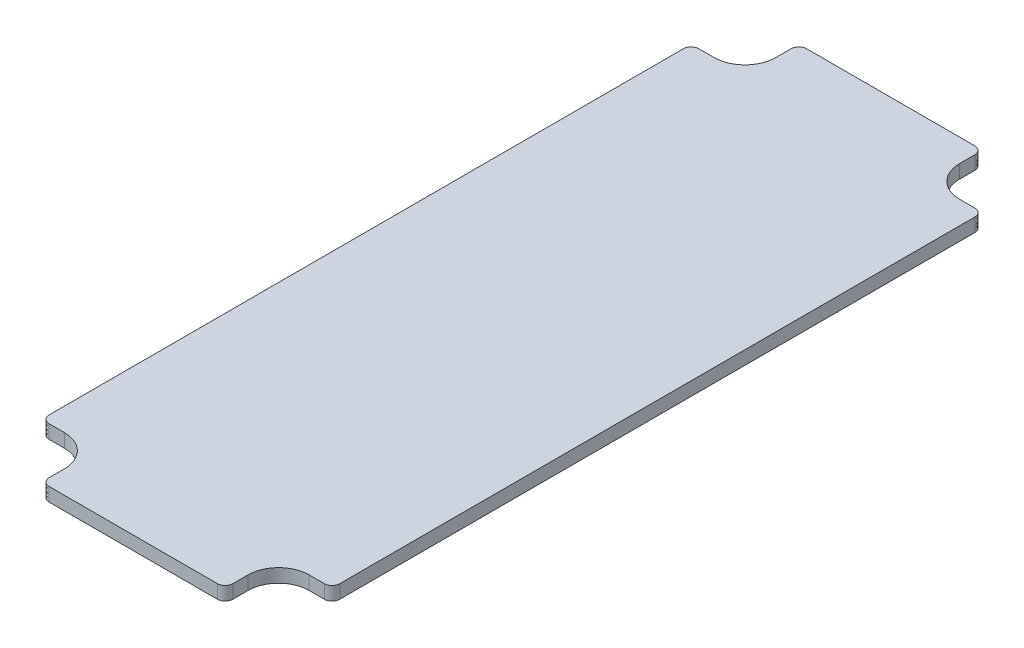
ISO-10303-21;
HEADER;
FILE_DESCRIPTION(('STEP AP214'),'2;1');
FILE_NAME('part.step','',(''),(''),'','','');
FILE_SCHEMA(('AUTOMOTIVE_DESIGN { 1 0 10303 214 1 1 1 1 }'));
ENDSEC;
DATA;
#1=APPLICATION_CONTEXT('core data for automotive mechanical design processes');
#2=APPLICATION_PROTOCOL_DEFINITION('international standard','automotive_design',2000,#1);
#3=PRODUCT_CONTEXT('',#1,'mechanical');
#4=PRODUCT('Part','Part','',(#3));
#5=PRODUCT_RELATED_PRODUCT_CATEGORY('part','',(#4));
#6=PRODUCT_DEFINITION_FORMATION('','',#4);
#7=PRODUCT_DEFINITION_CONTEXT('part definition',#1,'design');
#8=PRODUCT_DEFINITION('design','',#6,#7);
#9=PRODUCT_DEFINITION_SHAPE('','',#8);
#10=(LENGTH_UNIT() NAMED_UNIT(*) SI_UNIT(.MILLI.,.METRE.));
#11=(NAMED_UNIT(*) PLANE_ANGLE_UNIT() SI_UNIT($,.RADIAN.));
#12=(NAMED_UNIT(*) SI_UNIT($,.STERADIAN.) SOLID_ANGLE_UNIT());
#13=UNCERTAINTY_MEASURE_WITH_UNIT(LENGTH_MEASURE(1.E-05),#10,'distance_accuracy_value','');
#14=(GEOMETRIC_REPRESENTATION_CONTEXT(3) GLOBAL_UNCERTAINTY_ASSIGNED_CONTEXT((#13)) GLOBAL_UNIT_ASSIGNED_CONTEXT((#10,
#11,#12)) REPRESENTATION_CONTEXT('',''));
#15=CARTESIAN_POINT('',(0.,0.,0.));
#16=DIRECTION('',(0.,0.,1.));
#17=DIRECTION('',(1.,0.,0.));
#18=AXIS2_PLACEMENT_3D('',#15,#16,#17);
#19=CARTESIAN_POINT('',(-9.7028101652106,-13.879847669631,43.9524674901858));
#20=CARTESIAN_POINT('',(-9.81520922461106,-13.879847669631,43.9524674901858));
#21=CARTESIAN_POINT('',(-10.0350353697338,-13.879847669631,43.9138110143199));
#22=CARTESIAN_POINT('',(-10.3587966532664,-13.879847669631,43.708796653266));
#23=CARTESIAN_POINT('',(-10.5638110143203,-13.879847669631,43.3850353697334));
#24=CARTESIAN_POINT('',(-10.6024674901861,-13.879847669631,43.1652092246106));
#25=CARTESIAN_POINT('',(-10.6024674901861,-13.879847669631,43.0528101652102));
#26=B_SPLINE_CURVE_WITH_KNOTS('',3,(#19,#20,#21,#22,#23,#24,#25),.UNSPECIFIED.,.F.,.F.,(4,1,1,1,
4),(0.,0.25,0.5,0.75,1.),.UNSPECIFIED.);
#27=DIRECTION('',(0.,-1.,0.));
#28=VECTOR('',#27,1.);
#29=SURFACE_OF_LINEAR_EXTRUSION('',#26,#28);
#30=CARTESIAN_POINT('',(-9.70281016521058,-15.449847669631,43.9524674901858));
#31=CARTESIAN_POINT('',(-9.81520922461103,-15.449847669631,43.9524674901858));
#32=CARTESIAN_POINT('',(-10.0350353697338,-15.449847669631,43.9138110143199));
#33=CARTESIAN_POINT('',(-10.3587966532664,-15.449847669631,43.7087966532661));
#34=CARTESIAN_POINT('',(-10.5638110143202,-15.449847669631,43.3850353697335));
#35=CARTESIAN_POINT('',(-10.6024674901861,-15.449847669631,43.1652092246107));
#36=CARTESIAN_POINT('',(-10.6024674901861,-15.449847669631,43.0528101652102));
#37=B_SPLINE_CURVE_WITH_KNOTS('',3,(#30,#31,#32,#33,#34,#35,#36),.UNSPECIFIED.,.F.,.F.,(4,1,1,1,
4),(0.,0.25,0.5,0.75,1.),.UNSPECIFIED.);
#38=CARTESIAN_POINT('',(-9.70281016521058,-15.449847669631,43.9524674901858));
#39=VERTEX_POINT('',#38);
#40=CARTESIAN_POINT('',(-10.6024674901861,-15.449847669631,43.0528101652102));
#41=VERTEX_POINT('',#40);
#42=EDGE_CURVE('E393',#39,#41,#37,.T.);
#43=ORIENTED_EDGE('',*,*,#42,.F.);
#44=DIRECTION('',(0.,-1.,0.));
#45=VECTOR('',#44,1.);
#46=CARTESIAN_POINT('',(-9.7028101652106,-13.879847669631,43.9524674901858));
#47=LINE('',#46,#45);
#48=CARTESIAN_POINT('',(-9.7028101652106,-13.879847669631,43.9524674901858));
#49=VERTEX_POINT('',#48);
#50=EDGE_CURVE('E11',#49,#39,#47,.T.);
#51=ORIENTED_EDGE('',*,*,#50,.F.);
#52=CARTESIAN_POINT('',(-10.6024674901861,-13.879847669631,43.0528101652102));
#53=VERTEX_POINT('',#52);
#54=EDGE_CURVE('E341',#49,#53,#26,.T.);
#55=ORIENTED_EDGE('',*,*,#54,.T.);
#56=DIRECTION('',(0.,-1.,0.));
#57=VECTOR('',#56,1.);
#58=CARTESIAN_POINT('',(-10.6024674901861,-13.879847669631,43.0528101652102));
#59=LINE('',#58,#57);
#60=EDGE_CURVE('E37',#53,#41,#59,.T.);
#61=ORIENTED_EDGE('',*,*,#60,.T.);
#62=EDGE_LOOP('',(#43,#51,#55,#61));
#63=FACE_BOUND('',#62,.T.);
#64=ADVANCED_FACE('F33',(#63),#29,.T.);
#65=CARTESIAN_POINT('',(-9.7028101652106,-13.879847669631,43.9524674901858));
#66=DIRECTION('',(0.,0.,1.));
#67=DIRECTION('',(0.,-1.,0.));
#68=AXIS2_PLACEMENT_3D('',#65,#66,#67);
#69=PLANE('',#68);
#70=DIRECTION('',(-1.,0.,0.));
#71=VECTOR('',#70,1.);
#72=CARTESIAN_POINT('',(-9.70281016521058,-15.449847669631,43.9524674901858));
#73=LINE('',#72,#71);
#74=CARTESIAN_POINT('',(9.8028101652091,-15.4498476696307,43.9524674901862));
#75=VERTEX_POINT('',#74);
#76=EDGE_CURVE('E319',#75,#39,#73,.T.);
#77=ORIENTED_EDGE('',*,*,#76,.F.);
#78=DIRECTION('',(0.,-1.,0.));
#79=VECTOR('',#78,1.);
#80=CARTESIAN_POINT('',(9.80281016520908,-13.8798476696307,43.9524674901861));
#81=LINE('',#80,#79);
#82=CARTESIAN_POINT('',(9.80281016520908,-13.8798476696307,43.9524674901861));
#83=VERTEX_POINT('',#82);
#84=EDGE_CURVE('E43',#83,#75,#81,.T.);
#85=ORIENTED_EDGE('',*,*,#84,.F.);
#86=DIRECTION('',(-1.,0.,0.));
#87=VECTOR('',#86,1.);
#88=CARTESIAN_POINT('',(-9.7028101652106,-13.879847669631,43.9524674901858));
#89=LINE('',#88,#87);
#90=EDGE_CURVE('E217',#83,#49,#89,.T.);
#91=ORIENTED_EDGE('',*,*,#90,.T.);
#92=ORIENTED_EDGE('',*,*,#50,.T.);
#93=EDGE_LOOP('',(#77,#85,#91,#92));
#94=FACE_BOUND('',#93,.T.);
#95=ADVANCED_FACE('F237',(#94),#69,.T.);
#96=CARTESIAN_POINT('',(10.7024674901847,-13.8798476696307,43.0528101652106));
#97=CARTESIAN_POINT('',(10.7024674901847,-13.8798476696307,43.165209224611));
#98=CARTESIAN_POINT('',(10.6638110143188,-13.8798476696307,43.3850353697338));
#99=CARTESIAN_POINT('',(10.4587966532649,-13.8798476696307,43.7087966532664));
#100=CARTESIAN_POINT('',(10.1350353697323,-13.8798476696307,43.9138110143202));
#101=CARTESIAN_POINT('',(9.91520922460954,-13.8798476696307,43.9524674901861));
#102=CARTESIAN_POINT('',(9.80281016520908,-13.8798476696307,43.9524674901861));
#103=B_SPLINE_CURVE_WITH_KNOTS('',3,(#96,#97,#98,#99,#100,#101,#102),.UNSPECIFIED.,.F.,.F.,(4,1,
1,1,4),(0.,0.25,0.5,0.75,1.),.UNSPECIFIED.);
#104=DIRECTION('',(0.,-1.,0.));
#105=VECTOR('',#104,1.);
#106=SURFACE_OF_LINEAR_EXTRUSION('',#103,#105);
#107=CARTESIAN_POINT('',(10.7024674901847,-15.4498476696307,43.0528101652106));
#108=CARTESIAN_POINT('',(10.7024674901847,-15.4498476696307,43.1652092246111));
#109=CARTESIAN_POINT('',(10.6638110143188,-15.4498476696307,43.3850353697338));
#110=CARTESIAN_POINT('',(10.458796653265,-15.4498476696307,43.7087966532665));
#111=CARTESIAN_POINT('',(10.1350353697323,-15.4498476696307,43.9138110143203));
#112=CARTESIAN_POINT('',(9.91520922460956,-15.4498476696307,43.9524674901862));
#113=CARTESIAN_POINT('',(9.8028101652091,-15.4498476696307,43.9524674901862));
#114=B_SPLINE_CURVE_WITH_KNOTS('',3,(#107,#108,#109,#110,#111,#112,#113),.UNSPECIFIED.,.F.,.F.,
(4,1,1,1,4),(0.,0.25,0.5,0.75,1.),.UNSPECIFIED.);
#115=CARTESIAN_POINT('',(10.7024674901847,-15.4498476696307,43.0528101652106));
#116=VERTEX_POINT('',#115);
#117=EDGE_CURVE('E204',#116,#75,#114,.T.);
#118=ORIENTED_EDGE('',*,*,#117,.F.);
#119=DIRECTION('',(0.,-1.,0.));
#120=VECTOR('',#119,1.);
#121=CARTESIAN_POINT('',(10.7024674901847,-13.8798476696307,43.0528101652106));
#122=LINE('',#121,#120);
#123=CARTESIAN_POINT('',(10.7024674901847,-13.8798476696307,43.0528101652106));
#124=VERTEX_POINT('',#123);
#125=EDGE_CURVE('E199',#124,#116,#122,.T.);
#126=ORIENTED_EDGE('',*,*,#125,.F.);
#127=EDGE_CURVE('E202',#124,#83,#103,.T.);
#128=ORIENTED_EDGE('',*,*,#127,.T.);
#129=ORIENTED_EDGE('',*,*,#84,.T.);
#130=EDGE_LOOP('',(#118,#126,#128,#129));
#131=FACE_BOUND('',#130,.T.);
#132=ADVANCED_FACE('F201',(#131),#106,.T.);
#133=CARTESIAN_POINT('',(10.7024674901847,-13.8798476696307,43.0528101652106));
#134=DIRECTION('',(1.,0.,0.));
#135=DIRECTION('',(0.,1.,0.));
#136=AXIS2_PLACEMENT_3D('',#133,#134,#135);
#137=PLANE('',#136);
#138=DIRECTION('',(0.,0.,1.));
#139=VECTOR('',#138,1.);
#140=CARTESIAN_POINT('',(10.7024674901847,-15.4498476696307,43.0528101652106));
#141=LINE('',#140,#139);
#142=CARTESIAN_POINT('',(10.7024674901847,-15.4498476696308,41.3000000000008));
#143=VERTEX_POINT('',#142);
#144=EDGE_CURVE('E326',#143,#116,#141,.T.);
#145=ORIENTED_EDGE('',*,*,#144,.F.);
#146=DIRECTION('',(0.,-1.,0.));
#147=VECTOR('',#146,1.);
#148=CARTESIAN_POINT('',(10.7024674901847,-13.8798476696308,41.3000000000008));
#149=LINE('',#148,#147);
#150=CARTESIAN_POINT('',(10.7024674901847,-13.8798476696308,41.3000000000008));
#151=VERTEX_POINT('',#150);
#152=EDGE_CURVE('E209',#151,#143,#149,.T.);
#153=ORIENTED_EDGE('',*,*,#152,.F.);
#154=DIRECTION('',(0.,0.,1.));
#155=VECTOR('',#154,1.);
#156=CARTESIAN_POINT('',(10.7024674901847,-13.8798476696307,43.0528101652106));
#157=LINE('',#156,#155);
#158=EDGE_CURVE('E215',#151,#124,#157,.T.);
#159=ORIENTED_EDGE('',*,*,#158,.T.);
#160=ORIENTED_EDGE('',*,*,#125,.T.);
#161=EDGE_LOOP('',(#145,#153,#159,#160));
#162=FACE_BOUND('',#161,.T.);
#163=ADVANCED_FACE('F219',(#162),#137,.T.);
#164=CARTESIAN_POINT('',(14.2499999999993,-13.8798476696308,41.3000000000008));
#165=DIRECTION('',(0.,-1.,0.));
#166=DIRECTION('',(0.,0.,-1.));
#167=AXIS2_PLACEMENT_3D('',#164,#165,#166);
#168=CYLINDRICAL_SURFACE('',#167,3.54753250981462);
#169=CARTESIAN_POINT('',(14.2499999999993,-15.4498476696308,41.3000000000009));
#170=DIRECTION('',(0.,1.,0.));
#171=DIRECTION('',(0.,0.,-1.));
#172=AXIS2_PLACEMENT_3D('',#169,#170,#171);
#173=CIRCLE('',#172,3.54753250981462);
#174=CARTESIAN_POINT('',(14.2499999999993,-15.4498476696309,37.7524674901863));
#175=VERTEX_POINT('',#174);
#176=EDGE_CURVE('E324',#175,#143,#173,.T.);
#177=ORIENTED_EDGE('',*,*,#176,.F.);
#178=DIRECTION('',(0.,-1.,0.));
#179=VECTOR('',#178,1.);
#180=CARTESIAN_POINT('',(14.2499999999993,-13.8798476696309,37.7524674901862));
#181=LINE('',#180,#179);
#182=CARTESIAN_POINT('',(14.2499999999993,-13.8798476696309,37.7524674901862));
#183=VERTEX_POINT('',#182);
#184=EDGE_CURVE('E270',#183,#175,#181,.T.);
#185=ORIENTED_EDGE('',*,*,#184,.F.);
#186=CARTESIAN_POINT('',(14.2499999999993,-13.8798476696308,41.3000000000008));
#187=DIRECTION('',(0.,1.,0.));
#188=DIRECTION('',(0.,0.,-1.));
#189=AXIS2_PLACEMENT_3D('',#186,#187,#188);
#190=CIRCLE('',#189,3.54753250981462);
#191=EDGE_CURVE('E220',#183,#151,#190,.T.);
#192=ORIENTED_EDGE('',*,*,#191,.T.);
#193=ORIENTED_EDGE('',*,*,#152,.T.);
#194=EDGE_LOOP('',(#177,#185,#192,#193));
#195=FACE_BOUND('',#194,.T.);
#196=ADVANCED_FACE('F241',(#195),#168,.F.);
#197=CARTESIAN_POINT('',(14.2499999999994,-13.8798476696309,37.7524674901863));
#198=DIRECTION('',(0.,0.,1.));
#199=DIRECTION('',(0.,-1.,0.));
#200=AXIS2_PLACEMENT_3D('',#197,#198,#199);
#201=PLANE('',#200);
#202=DIRECTION('',(-1.,0.,0.));
#203=VECTOR('',#202,1.);
#204=CARTESIAN_POINT('',(14.2499999999994,-15.4498476696309,37.7524674901863));
#205=LINE('',#204,#203);
#206=CARTESIAN_POINT('',(16.0028101652093,-15.4498476696309,37.7524674901864));
#207=VERTEX_POINT('',#206);
#208=EDGE_CURVE('E331',#207,#175,#205,.T.);
#209=ORIENTED_EDGE('',*,*,#208,.F.);
#210=DIRECTION('',(0.,-1.,0.));
#211=VECTOR('',#210,1.);
#212=CARTESIAN_POINT('',(16.0028101652093,-13.8798476696309,37.7524674901863));
#213=LINE('',#212,#211);
#214=CARTESIAN_POINT('',(16.0028101652093,-13.8798476696309,37.7524674901863));
#215=VERTEX_POINT('',#214);
#216=EDGE_CURVE('E272',#215,#207,#213,.T.);
#217=ORIENTED_EDGE('',*,*,#216,.F.);
#218=DIRECTION('',(-1.,0.,0.));
#219=VECTOR('',#218,1.);
#220=CARTESIAN_POINT('',(14.2499999999994,-13.8798476696309,37.7524674901863));
#221=LINE('',#220,#219);
#222=EDGE_CURVE('E222',#215,#183,#221,.T.);
#223=ORIENTED_EDGE('',*,*,#222,.T.);
#224=ORIENTED_EDGE('',*,*,#184,.T.);
#225=EDGE_LOOP('',(#209,#217,#223,#224));
#226=FACE_BOUND('',#225,.T.);
#227=ADVANCED_FACE('F244',(#226),#201,.T.);
#228=CARTESIAN_POINT('',(16.9024674901849,-13.8798476696309,36.8528101652108));
#229=CARTESIAN_POINT('',(16.9024674901848,-13.8798476696309,36.9652092246112));
#230=CARTESIAN_POINT('',(16.863811014319,-13.8798476696309,37.185035369734));
#231=CARTESIAN_POINT('',(16.6587966532651,-13.8798476696309,37.5087966532666));
#232=CARTESIAN_POINT('',(16.3350353697325,-13.8798476696309,37.7138110143204));
#233=CARTESIAN_POINT('',(16.1152092246097,-13.8798476696309,37.7524674901863));
#234=CARTESIAN_POINT('',(16.0028101652093,-13.8798476696309,37.7524674901863));
#235=B_SPLINE_CURVE_WITH_KNOTS('',3,(#228,#229,#230,#231,#232,#233,#234),.UNSPECIFIED.,.F.,.F.,
(4,1,1,1,4),(0.,0.25,0.5,0.75,1.),.UNSPECIFIED.);
#236=DIRECTION('',(0.,-1.,0.));
#237=VECTOR('',#236,1.);
#238=SURFACE_OF_LINEAR_EXTRUSION('',#235,#237);
#239=CARTESIAN_POINT('',(16.9024674901849,-15.4498476696309,36.8528101652108));
#240=CARTESIAN_POINT('',(16.9024674901849,-15.4498476696309,36.9652092246113));
#241=CARTESIAN_POINT('',(16.863811014319,-15.4498476696309,37.1850353697341));
#242=CARTESIAN_POINT('',(16.6587966532652,-15.4498476696309,37.5087966532667));
#243=CARTESIAN_POINT('',(16.3350353697325,-15.4498476696309,37.7138110143205));
#244=CARTESIAN_POINT('',(16.1152092246098,-15.4498476696309,37.7524674901864));
#245=CARTESIAN_POINT('',(16.0028101652093,-15.4498476696309,37.7524674901864));
#246=B_SPLINE_CURVE_WITH_KNOTS('',3,(#239,#240,#241,#242,#243,#244,#245),.UNSPECIFIED.,.F.,.F.,
(4,1,1,1,4),(0.,0.25,0.5,0.75,1.),.UNSPECIFIED.);
#247=CARTESIAN_POINT('',(16.9024674901849,-15.4498476696309,36.8528101652108));
#248=VERTEX_POINT('',#247);
#249=EDGE_CURVE('E279',#248,#207,#246,.T.);
#250=ORIENTED_EDGE('',*,*,#249,.F.);
#251=DIRECTION('',(0.,-1.,0.));
#252=VECTOR('',#251,1.);
#253=CARTESIAN_POINT('',(16.9024674901849,-13.8798476696309,36.8528101652108));
#254=LINE('',#253,#252);
#255=CARTESIAN_POINT('',(16.9024674901849,-13.8798476696309,36.8528101652108));
#256=VERTEX_POINT('',#255);
#257=EDGE_CURVE('E277',#256,#248,#254,.T.);
#258=ORIENTED_EDGE('',*,*,#257,.F.);
#259=EDGE_CURVE('E256',#256,#215,#235,.T.);
#260=ORIENTED_EDGE('',*,*,#259,.T.);
#261=ORIENTED_EDGE('',*,*,#216,.T.);
#262=EDGE_LOOP('',(#250,#258,#260,#261));
#263=FACE_BOUND('',#262,.T.);
#264=ADVANCED_FACE('F248',(#263),#238,.T.);
#265=CARTESIAN_POINT('',(16.9024674901849,-13.8798476696309,36.8528101652108));
#266=DIRECTION('',(1.,0.,0.));
#267=DIRECTION('',(0.,0.,-1.));
#268=AXIS2_PLACEMENT_3D('',#265,#266,#267);
#269=PLANE('',#268);
#270=DIRECTION('',(0.,0.,1.));
#271=VECTOR('',#270,1.);
#272=CARTESIAN_POINT('',(16.9024674901849,-15.4498476696309,36.8528101652108));
#273=LINE('',#272,#271);
#274=CARTESIAN_POINT('',(16.9024674901865,-15.4498476696337,-36.8028101652089));
#275=VERTEX_POINT('',#274);
#276=EDGE_CURVE('E470',#275,#248,#273,.T.);
#277=ORIENTED_EDGE('',*,*,#276,.F.);
#278=DIRECTION('',(0.,-1.,0.));
#279=VECTOR('',#278,1.);
#280=CARTESIAN_POINT('',(16.9024674901865,-13.8798476696337,-36.8028101652089));
#281=LINE('',#280,#279);
#282=CARTESIAN_POINT('',(16.9024674901865,-13.8798476696337,-36.8028101652089));
#283=VERTEX_POINT('',#282);
#284=EDGE_CURVE('E283',#283,#275,#281,.T.);
#285=ORIENTED_EDGE('',*,*,#284,.F.);
#286=DIRECTION('',(0.,0.,1.));
#287=VECTOR('',#286,1.);
#288=CARTESIAN_POINT('',(16.9024674901849,-13.8798476696309,36.8528101652108));
#289=LINE('',#288,#287);
#290=EDGE_CURVE('E262',#283,#256,#289,.T.);
#291=ORIENTED_EDGE('',*,*,#290,.T.);
#292=ORIENTED_EDGE('',*,*,#257,.T.);
#293=EDGE_LOOP('',(#277,#285,#291,#292));
#294=FACE_BOUND('',#293,.T.);
#295=ADVANCED_FACE('F253',(#294),#269,.T.);
#296=CARTESIAN_POINT('',(16.0028101652109,-13.8798476696338,-37.7024674901845));
#297=CARTESIAN_POINT('',(16.1152092246114,-13.8798476696338,-37.7024674901845));
#298=CARTESIAN_POINT('',(16.3350353697342,-13.8798476696338,-37.6638110143186));
#299=CARTESIAN_POINT('',(16.6587966532668,-13.8798476696337,-37.4587966532648));
#300=CARTESIAN_POINT('',(16.8638110143206,-13.8798476696337,-37.1350353697322));
#301=CARTESIAN_POINT('',(16.9024674901865,-13.8798476696337,-36.9152092246094));
#302=CARTESIAN_POINT('',(16.9024674901865,-13.8798476696337,-36.8028101652089));
#303=B_SPLINE_CURVE_WITH_KNOTS('',3,(#296,#297,#298,#299,#300,#301,#302),.UNSPECIFIED.,.F.,.F.,
(4,1,1,1,4),(0.,0.25,0.5,0.75,1.),.UNSPECIFIED.);
#304=DIRECTION('',(0.,-1.,0.));
#305=VECTOR('',#304,1.);
#306=SURFACE_OF_LINEAR_EXTRUSION('',#303,#305);
#307=CARTESIAN_POINT('',(16.0028101652109,-15.4498476696338,-37.7024674901845));
#308=CARTESIAN_POINT('',(16.1152092246114,-15.4498476696338,-37.7024674901845));
#309=CARTESIAN_POINT('',(16.3350353697342,-15.4498476696338,-37.6638110143186));
#310=CARTESIAN_POINT('',(16.6587966532668,-15.4498476696337,-37.4587966532647));
#311=CARTESIAN_POINT('',(16.8638110143206,-15.4498476696337,-37.1350353697321));
#312=CARTESIAN_POINT('',(16.9024674901865,-15.4498476696337,-36.9152092246093));
#313=CARTESIAN_POINT('',(16.9024674901865,-15.4498476696337,-36.8028101652089));
#314=B_SPLINE_CURVE_WITH_KNOTS('',3,(#307,#308,#309,#310,#311,#312,#313),.UNSPECIFIED.,.F.,.F.,
(4,1,1,1,4),(0.,0.25,0.5,0.75,1.),.UNSPECIFIED.);
#315=CARTESIAN_POINT('',(16.0028101652109,-15.4498476696338,-37.7024674901845));
#316=VERTEX_POINT('',#315);
#317=EDGE_CURVE('E465',#316,#275,#314,.T.);
#318=ORIENTED_EDGE('',*,*,#317,.F.);
#319=DIRECTION('',(0.,-1.,0.));
#320=VECTOR('',#319,1.);
#321=CARTESIAN_POINT('',(16.0028101652109,-13.8798476696338,-37.7024674901845));
#322=LINE('',#321,#320);
#323=CARTESIAN_POINT('',(16.0028101652109,-13.8798476696338,-37.7024674901845));
#324=VERTEX_POINT('',#323);
#325=EDGE_CURVE('E286',#324,#316,#322,.T.);
#326=ORIENTED_EDGE('',*,*,#325,.F.);
#327=EDGE_CURVE('E484',#324,#283,#303,.T.);
#328=ORIENTED_EDGE('',*,*,#327,.T.);
#329=ORIENTED_EDGE('',*,*,#284,.T.);
#330=EDGE_LOOP('',(#318,#326,#328,#329));
#331=FACE_BOUND('',#330,.T.);
#332=ADVANCED_FACE('F486',(#331),#306,.T.);
#333=CARTESIAN_POINT('',(16.0028101652109,-13.8798476696338,-37.7024674901845));
#334=DIRECTION('',(0.,0.,-1.));
#335=DIRECTION('',(-1.,0.,0.));
#336=AXIS2_PLACEMENT_3D('',#333,#334,#335);
#337=PLANE('',#336);
#338=DIRECTION('',(1.,0.,0.));
#339=VECTOR('',#338,1.);
#340=CARTESIAN_POINT('',(16.0028101652109,-15.4498476696338,-37.7024674901845));
#341=LINE('',#340,#339);
#342=CARTESIAN_POINT('',(14.250000000001,-15.4498476696338,-37.7024674901846));
#343=VERTEX_POINT('',#342);
#344=EDGE_CURVE('E462',#343,#316,#341,.T.);
#345=ORIENTED_EDGE('',*,*,#344,.F.);
#346=DIRECTION('',(0.,-1.,0.));
#347=VECTOR('',#346,1.);
#348=CARTESIAN_POINT('',(14.250000000001,-13.8798476696338,-37.7024674901846));
#349=LINE('',#348,#347);
#350=CARTESIAN_POINT('',(14.250000000001,-13.8798476696338,-37.7024674901846));
#351=VERTEX_POINT('',#350);
#352=EDGE_CURVE('E291',#351,#343,#349,.T.);
#353=ORIENTED_EDGE('',*,*,#352,.F.);
#354=DIRECTION('',(1.,0.,0.));
#355=VECTOR('',#354,1.);
#356=CARTESIAN_POINT('',(16.0028101652109,-13.8798476696338,-37.7024674901845));
#357=LINE('',#356,#355);
#358=EDGE_CURVE('E487',#351,#324,#357,.T.);
#359=ORIENTED_EDGE('',*,*,#358,.T.);
#360=ORIENTED_EDGE('',*,*,#325,.T.);
#361=EDGE_LOOP('',(#345,#353,#359,#360));
#362=FACE_BOUND('',#361,.T.);
#363=ADVANCED_FACE('F499',(#362),#337,.T.);
#364=CARTESIAN_POINT('',(14.2500000000011,-13.8798476696339,-41.2999999999992));
#365=DIRECTION('',(0.,-1.,0.));
#366=DIRECTION('',(0.,0.,-1.));
#367=AXIS2_PLACEMENT_3D('',#364,#365,#366);
#368=CYLINDRICAL_SURFACE('',#367,3.59753250981455);
#369=CARTESIAN_POINT('',(14.2500000000011,-15.4498476696339,-41.2999999999991));
#370=DIRECTION('',(0.,1.,0.));
#371=DIRECTION('',(0.,0.,-1.));
#372=AXIS2_PLACEMENT_3D('',#369,#370,#371);
#373=CIRCLE('',#372,3.59753250981455);
#374=CARTESIAN_POINT('',(10.6524674901865,-15.449847669634,-41.2999999999992));
#375=VERTEX_POINT('',#374);
#376=EDGE_CURVE('E459',#375,#343,#373,.T.);
#377=ORIENTED_EDGE('',*,*,#376,.F.);
#378=DIRECTION('',(0.,-1.,0.));
#379=VECTOR('',#378,1.);
#380=CARTESIAN_POINT('',(10.6524674901865,-13.879847669634,-41.2999999999992));
#381=LINE('',#380,#379);
#382=CARTESIAN_POINT('',(10.6524674901865,-13.879847669634,-41.2999999999992));
#383=VERTEX_POINT('',#382);
#384=EDGE_CURVE('E293',#383,#375,#381,.T.);
#385=ORIENTED_EDGE('',*,*,#384,.F.);
#386=CARTESIAN_POINT('',(14.2500000000011,-13.8798476696339,-41.2999999999992));
#387=DIRECTION('',(0.,1.,0.));
#388=DIRECTION('',(0.,0.,-1.));
#389=AXIS2_PLACEMENT_3D('',#386,#387,#388);
#390=CIRCLE('',#389,3.59753250981455);
#391=EDGE_CURVE('E488',#383,#351,#390,.T.);
#392=ORIENTED_EDGE('',*,*,#391,.T.);
#393=ORIENTED_EDGE('',*,*,#352,.T.);
#394=EDGE_LOOP('',(#377,#385,#392,#393));
#395=FACE_BOUND('',#394,.T.);
#396=ADVANCED_FACE('F502',(#395),#368,.F.);
#397=CARTESIAN_POINT('',(10.6524674901865,-13.879847669634,-41.2999999999992));
#398=DIRECTION('',(1.,0.,0.));
#399=DIRECTION('',(0.,1.,0.));
#400=AXIS2_PLACEMENT_3D('',#397,#398,#399);
#401=PLANE('',#400);
#402=DIRECTION('',(0.,0.,1.));
#403=VECTOR('',#402,1.);
#404=CARTESIAN_POINT('',(10.6524674901865,-15.449847669634,-41.2999999999992));
#405=LINE('',#404,#403);
#406=CARTESIAN_POINT('',(10.6524674901865,-15.449847669634,-43.0528101652091));
#407=VERTEX_POINT('',#406);
#408=EDGE_CURVE('E453',#407,#375,#405,.T.);
#409=ORIENTED_EDGE('',*,*,#408,.F.);
#410=DIRECTION('',(0.,-1.,0.));
#411=VECTOR('',#410,1.);
#412=CARTESIAN_POINT('',(10.6524674901865,-13.879847669634,-43.0528101652091));
#413=LINE('',#412,#411);
#414=CARTESIAN_POINT('',(10.6524674901865,-13.879847669634,-43.0528101652091));
#415=VERTEX_POINT('',#414);
#416=EDGE_CURVE('E295',#415,#407,#413,.T.);
#417=ORIENTED_EDGE('',*,*,#416,.F.);
#418=DIRECTION('',(0.,0.,1.));
#419=VECTOR('',#418,1.);
#420=CARTESIAN_POINT('',(10.6524674901865,-13.879847669634,-41.2999999999992));
#421=LINE('',#420,#419);
#422=EDGE_CURVE('E525',#415,#383,#421,.T.);
#423=ORIENTED_EDGE('',*,*,#422,.T.);
#424=ORIENTED_EDGE('',*,*,#384,.T.);
#425=EDGE_LOOP('',(#409,#417,#423,#424));
#426=FACE_BOUND('',#425,.T.);
#427=ADVANCED_FACE('F506',(#426),#401,.T.);
#428=CARTESIAN_POINT('',(9.75281016521098,-13.8798476696341,-43.9524674901847));
#429=CARTESIAN_POINT('',(9.86520922461144,-13.8798476696341,-43.9524674901847));
#430=CARTESIAN_POINT('',(10.0850353697342,-13.8798476696341,-43.9138110143188));
#431=CARTESIAN_POINT('',(10.4087966532668,-13.8798476696341,-43.708796653265));
#432=CARTESIAN_POINT('',(10.6138110143206,-13.8798476696341,-43.3850353697324));
#433=CARTESIAN_POINT('',(10.6524674901865,-13.879847669634,-43.1652092246096));
#434=CARTESIAN_POINT('',(10.6524674901865,-13.879847669634,-43.0528101652091));
#435=B_SPLINE_CURVE_WITH_KNOTS('',3,(#428,#429,#430,#431,#432,#433,#434),.UNSPECIFIED.,.F.,.F.,
(4,1,1,1,4),(0.,0.25,0.5,0.75,1.),.UNSPECIFIED.);
#436=DIRECTION('',(0.,-1.,0.));
#437=VECTOR('',#436,1.);
#438=SURFACE_OF_LINEAR_EXTRUSION('',#435,#437);
#439=CARTESIAN_POINT('',(9.75281016521101,-15.4498476696341,-43.9524674901846));
#440=CARTESIAN_POINT('',(9.86520922461146,-15.4498476696341,-43.9524674901846));
#441=CARTESIAN_POINT('',(10.0850353697343,-15.4498476696341,-43.9138110143188));
#442=CARTESIAN_POINT('',(10.4087966532669,-15.4498476696341,-43.7087966532649));
#443=CARTESIAN_POINT('',(10.6138110143207,-15.4498476696341,-43.3850353697323));
#444=CARTESIAN_POINT('',(10.6524674901866,-15.449847669634,-43.1652092246095));
#445=CARTESIAN_POINT('',(10.6524674901865,-15.449847669634,-43.0528101652091));
#446=B_SPLINE_CURVE_WITH_KNOTS('',3,(#439,#440,#441,#442,#443,#444,#445),.UNSPECIFIED.,.F.,.F.,
(4,1,1,1,4),(0.,0.25,0.5,0.75,1.),.UNSPECIFIED.);
#447=CARTESIAN_POINT('',(9.75281016521101,-15.4498476696341,-43.9524674901846));
#448=VERTEX_POINT('',#447);
#449=EDGE_CURVE('E448',#448,#407,#446,.T.);
#450=ORIENTED_EDGE('',*,*,#449,.F.);
#451=DIRECTION('',(0.,-1.,0.));
#452=VECTOR('',#451,1.);
#453=CARTESIAN_POINT('',(9.75281016521098,-13.8798476696341,-43.9524674901847));
#454=LINE('',#453,#452);
#455=CARTESIAN_POINT('',(9.75281016521098,-13.8798476696341,-43.9524674901847));
#456=VERTEX_POINT('',#455);
#457=EDGE_CURVE('E297',#456,#448,#454,.T.);
#458=ORIENTED_EDGE('',*,*,#457,.F.);
#459=EDGE_CURVE('E518',#456,#415,#435,.T.);
#460=ORIENTED_EDGE('',*,*,#459,.T.);
#461=ORIENTED_EDGE('',*,*,#416,.T.);
#462=EDGE_LOOP('',(#450,#458,#460,#461));
#463=FACE_BOUND('',#462,.T.);
#464=ADVANCED_FACE('F510',(#463),#438,.T.);
#465=CARTESIAN_POINT('',(9.75281016521098,-13.8798476696341,-43.9524674901847));
#466=DIRECTION('',(0.,0.,-1.));
#467=DIRECTION('',(0.,1.,0.));
#468=AXIS2_PLACEMENT_3D('',#465,#466,#467);
#469=PLANE('',#468);
#470=DIRECTION('',(1.,0.,0.));
#471=VECTOR('',#470,1.);
#472=CARTESIAN_POINT('',(9.75281016521101,-15.4498476696341,-43.9524674901846));
#473=LINE('',#472,#471);
#474=CARTESIAN_POINT('',(-9.75281016520877,-15.4498476696344,-43.952467490185));
#475=VERTEX_POINT('',#474);
#476=EDGE_CURVE('E442',#475,#448,#473,.T.);
#477=ORIENTED_EDGE('',*,*,#476,.F.);
#478=DIRECTION('',(0.,-1.,0.));
#479=VECTOR('',#478,1.);
#480=CARTESIAN_POINT('',(-9.75281016520879,-13.8798476696344,-43.952467490185));
#481=LINE('',#480,#479);
#482=CARTESIAN_POINT('',(-9.75281016520879,-13.8798476696344,-43.952467490185));
#483=VERTEX_POINT('',#482);
#484=EDGE_CURVE('E299',#483,#475,#481,.T.);
#485=ORIENTED_EDGE('',*,*,#484,.F.);
#486=DIRECTION('',(1.,0.,0.));
#487=VECTOR('',#486,1.);
#488=CARTESIAN_POINT('',(9.75281016521098,-13.8798476696341,-43.9524674901847));
#489=LINE('',#488,#487);
#490=EDGE_CURVE('E526',#483,#456,#489,.T.);
#491=ORIENTED_EDGE('',*,*,#490,.T.);
#492=ORIENTED_EDGE('',*,*,#457,.T.);
#493=EDGE_LOOP('',(#477,#485,#491,#492));
#494=FACE_BOUND('',#493,.T.);
#495=ADVANCED_FACE('F515',(#494),#469,.T.);
#496=CARTESIAN_POINT('',(-10.6524674901844,-13.8798476696343,-43.0528101652095));
#497=CARTESIAN_POINT('',(-10.6524674901844,-13.8798476696343,-43.16520922461));
#498=CARTESIAN_POINT('',(-10.6138110143185,-13.8798476696343,-43.3850353697327));
#499=CARTESIAN_POINT('',(-10.4087966532647,-13.8798476696344,-43.7087966532653));
#500=CARTESIAN_POINT('',(-10.085035369732,-13.8798476696344,-43.9138110143192));
#501=CARTESIAN_POINT('',(-9.86520922460925,-13.8798476696344,-43.952467490185));
#502=CARTESIAN_POINT('',(-9.75281016520879,-13.8798476696344,-43.952467490185));
#503=B_SPLINE_CURVE_WITH_KNOTS('',3,(#496,#497,#498,#499,#500,#501,#502),.UNSPECIFIED.,.F.,.F.,
(4,1,1,1,4),(0.,0.25,0.5,0.75,1.),.UNSPECIFIED.);
#504=DIRECTION('',(0.,-1.,0.));
#505=VECTOR('',#504,1.);
#506=SURFACE_OF_LINEAR_EXTRUSION('',#503,#505);
#507=CARTESIAN_POINT('',(-10.6524674901843,-15.4498476696343,-43.0528101652095));
#508=CARTESIAN_POINT('',(-10.6524674901843,-15.4498476696343,-43.1652092246099));
#509=CARTESIAN_POINT('',(-10.6138110143185,-15.4498476696343,-43.3850353697327));
#510=CARTESIAN_POINT('',(-10.4087966532646,-15.4498476696344,-43.7087966532653));
#511=CARTESIAN_POINT('',(-10.085035369732,-15.4498476696344,-43.9138110143191));
#512=CARTESIAN_POINT('',(-9.86520922460923,-15.4498476696344,-43.952467490185));
#513=CARTESIAN_POINT('',(-9.75281016520877,-15.4498476696344,-43.952467490185));
#514=B_SPLINE_CURVE_WITH_KNOTS('',3,(#507,#508,#509,#510,#511,#512,#513),.UNSPECIFIED.,.F.,.F.,
(4,1,1,1,4),(0.,0.25,0.5,0.75,1.),.UNSPECIFIED.);
#515=CARTESIAN_POINT('',(-10.6524674901843,-15.4498476696343,-43.0528101652095));
#516=VERTEX_POINT('',#515);
#517=EDGE_CURVE('E437',#516,#475,#514,.T.);
#518=ORIENTED_EDGE('',*,*,#517,.F.);
#519=DIRECTION('',(0.,-1.,0.));
#520=VECTOR('',#519,1.);
#521=CARTESIAN_POINT('',(-10.6524674901844,-13.8798476696343,-43.0528101652095));
#522=LINE('',#521,#520);
#523=CARTESIAN_POINT('',(-10.6524674901844,-13.8798476696343,-43.0528101652095));
#524=VERTEX_POINT('',#523);
#525=EDGE_CURVE('E301',#524,#516,#522,.T.);
#526=ORIENTED_EDGE('',*,*,#525,.F.);
#527=EDGE_CURVE('E546',#524,#483,#503,.T.);
#528=ORIENTED_EDGE('',*,*,#527,.T.);
#529=ORIENTED_EDGE('',*,*,#484,.T.);
#530=EDGE_LOOP('',(#518,#526,#528,#529));
#531=FACE_BOUND('',#530,.T.);
#532=ADVANCED_FACE('F559',(#531),#506,.T.);
#533=CARTESIAN_POINT('',(-10.6524674901844,-13.8798476696343,-43.0528101652095));
#534=DIRECTION('',(-1.,0.,0.));
#535=DIRECTION('',(0.,-1.,0.));
#536=AXIS2_PLACEMENT_3D('',#533,#534,#535);
#537=PLANE('',#536);
#538=DIRECTION('',(0.,0.,-1.));
#539=VECTOR('',#538,1.);
#540=CARTESIAN_POINT('',(-10.6524674901843,-15.4498476696343,-43.0528101652095));
#541=LINE('',#540,#539);
#542=CARTESIAN_POINT('',(-10.6524674901844,-15.4498476696343,-41.2999999999996));
#543=VERTEX_POINT('',#542);
#544=EDGE_CURVE('E434',#543,#516,#541,.T.);
#545=ORIENTED_EDGE('',*,*,#544,.F.);
#546=DIRECTION('',(0.,-1.,0.));
#547=VECTOR('',#546,1.);
#548=CARTESIAN_POINT('',(-10.6524674901844,-13.8798476696343,-41.2999999999997));
#549=LINE('',#548,#547);
#550=CARTESIAN_POINT('',(-10.6524674901844,-13.8798476696343,-41.2999999999997));
#551=VERTEX_POINT('',#550);
#552=EDGE_CURVE('E303',#551,#543,#549,.T.);
#553=ORIENTED_EDGE('',*,*,#552,.F.);
#554=DIRECTION('',(0.,0.,-1.));
#555=VECTOR('',#554,1.);
#556=CARTESIAN_POINT('',(-10.6524674901844,-13.8798476696343,-43.0528101652095));
#557=LINE('',#556,#555);
#558=EDGE_CURVE('E547',#551,#524,#557,.T.);
#559=ORIENTED_EDGE('',*,*,#558,.T.);
#560=ORIENTED_EDGE('',*,*,#525,.T.);
#561=EDGE_LOOP('',(#545,#553,#559,#560));
#562=FACE_BOUND('',#561,.T.);
#563=ADVANCED_FACE('F562',(#562),#537,.T.);
#564=CARTESIAN_POINT('',(-14.2499999999989,-13.8798476696343,-41.2999999999998));
#565=DIRECTION('',(0.,-1.,0.));
#566=DIRECTION('',(0.,0.,-1.));
#567=AXIS2_PLACEMENT_3D('',#564,#565,#566);
#568=CYLINDRICAL_SURFACE('',#567,3.59753250981456);
#569=CARTESIAN_POINT('',(-14.2499999999989,-15.4498476696343,-41.2999999999997));
#570=DIRECTION('',(0.,1.,0.));
#571=DIRECTION('',(0.,0.,-1.));
#572=AXIS2_PLACEMENT_3D('',#569,#570,#571);
#573=CIRCLE('',#572,3.59753250981456);
#574=CARTESIAN_POINT('',(-14.249999999999,-15.4498476696342,-37.7024674901851));
#575=VERTEX_POINT('',#574);
#576=EDGE_CURVE('E431',#575,#543,#573,.T.);
#577=ORIENTED_EDGE('',*,*,#576,.F.);
#578=DIRECTION('',(0.,-1.,0.));
#579=VECTOR('',#578,1.);
#580=CARTESIAN_POINT('',(-14.249999999999,-13.8798476696342,-37.7024674901852));
#581=LINE('',#580,#579);
#582=CARTESIAN_POINT('',(-14.249999999999,-13.8798476696342,-37.7024674901852));
#583=VERTEX_POINT('',#582);
#584=EDGE_CURVE('E305',#583,#575,#581,.T.);
#585=ORIENTED_EDGE('',*,*,#584,.F.);
#586=CARTESIAN_POINT('',(-14.2499999999989,-13.8798476696343,-41.2999999999998));
#587=DIRECTION('',(0.,1.,0.));
#588=DIRECTION('',(0.,0.,-1.));
#589=AXIS2_PLACEMENT_3D('',#586,#587,#588);
#590=CIRCLE('',#589,3.59753250981456);
#591=EDGE_CURVE('E550',#583,#551,#590,.T.);
#592=ORIENTED_EDGE('',*,*,#591,.T.);
#593=ORIENTED_EDGE('',*,*,#552,.T.);
#594=EDGE_LOOP('',(#577,#585,#592,#593));
#595=FACE_BOUND('',#594,.T.);
#596=ADVANCED_FACE('F565',(#595),#568,.F.);
#597=CARTESIAN_POINT('',(-14.249999999999,-13.8798476696342,-37.7024674901852));
#598=DIRECTION('',(0.,0.,-1.));
#599=DIRECTION('',(0.,1.,0.));
#600=AXIS2_PLACEMENT_3D('',#597,#598,#599);
#601=PLANE('',#600);
#602=DIRECTION('',(1.,0.,0.));
#603=VECTOR('',#602,1.);
#604=CARTESIAN_POINT('',(-14.249999999999,-15.4498476696342,-37.7024674901851));
#605=LINE('',#604,#603);
#606=CARTESIAN_POINT('',(-16.0028101652089,-15.4498476696342,-37.7024674901852));
#607=VERTEX_POINT('',#606);
#608=EDGE_CURVE('E425',#607,#575,#605,.T.);
#609=ORIENTED_EDGE('',*,*,#608,.F.);
#610=DIRECTION('',(0.,-1.,0.));
#611=VECTOR('',#610,1.);
#612=CARTESIAN_POINT('',(-16.0028101652089,-13.8798476696342,-37.7024674901852));
#613=LINE('',#612,#611);
#614=CARTESIAN_POINT('',(-16.0028101652089,-13.8798476696342,-37.7024674901852));
#615=VERTEX_POINT('',#614);
#616=EDGE_CURVE('E307',#615,#607,#613,.T.);
#617=ORIENTED_EDGE('',*,*,#616,.F.);
#618=DIRECTION('',(1.,0.,0.));
#619=VECTOR('',#618,1.);
#620=CARTESIAN_POINT('',(-14.249999999999,-13.8798476696342,-37.7024674901852));
#621=LINE('',#620,#619);
#622=EDGE_CURVE('E582',#615,#583,#621,.T.);
#623=ORIENTED_EDGE('',*,*,#622,.T.);
#624=ORIENTED_EDGE('',*,*,#584,.T.);
#625=EDGE_LOOP('',(#609,#617,#623,#624));
#626=FACE_BOUND('',#625,.T.);
#627=ADVANCED_FACE('F569',(#626),#601,.T.);
#628=CARTESIAN_POINT('',(-16.9024674901845,-13.8798476696342,-36.8028101652097));
#629=CARTESIAN_POINT('',(-16.9024674901845,-13.8798476696342,-36.9152092246102));
#630=CARTESIAN_POINT('',(-16.8638110143186,-13.8798476696342,-37.1350353697329));
#631=CARTESIAN_POINT('',(-16.6587966532648,-13.8798476696342,-37.4587966532656));
#632=CARTESIAN_POINT('',(-16.3350353697321,-13.8798476696342,-37.6638110143193));
#633=CARTESIAN_POINT('',(-16.1152092246093,-13.8798476696342,-37.7024674901852));
#634=CARTESIAN_POINT('',(-16.0028101652089,-13.8798476696342,-37.7024674901852));
#635=B_SPLINE_CURVE_WITH_KNOTS('',3,(#628,#629,#630,#631,#632,#633,#634),.UNSPECIFIED.,.F.,.F.,
(4,1,1,1,4),(0.,0.25,0.5,0.75,1.),.UNSPECIFIED.);
#636=DIRECTION('',(0.,-1.,0.));
#637=VECTOR('',#636,1.);
#638=SURFACE_OF_LINEAR_EXTRUSION('',#635,#637);
#639=CARTESIAN_POINT('',(-16.9024674901844,-15.4498476696342,-36.8028101652096));
#640=CARTESIAN_POINT('',(-16.9024674901844,-15.4498476696342,-36.9152092246101));
#641=CARTESIAN_POINT('',(-16.8638110143186,-15.4498476696342,-37.1350353697329));
#642=CARTESIAN_POINT('',(-16.6587966532647,-15.4498476696342,-37.4587966532655));
#643=CARTESIAN_POINT('',(-16.3350353697321,-15.4498476696342,-37.6638110143193));
#644=CARTESIAN_POINT('',(-16.1152092246093,-15.4498476696342,-37.7024674901852));
#645=CARTESIAN_POINT('',(-16.0028101652089,-15.4498476696342,-37.7024674901852));
#646=B_SPLINE_CURVE_WITH_KNOTS('',3,(#639,#640,#641,#642,#643,#644,#645),.UNSPECIFIED.,.F.,.F.,
(4,1,1,1,4),(0.,0.25,0.5,0.75,1.),.UNSPECIFIED.);
#647=CARTESIAN_POINT('',(-16.9024674901844,-15.4498476696342,-36.8028101652096));
#648=VERTEX_POINT('',#647);
#649=EDGE_CURVE('E420',#648,#607,#646,.T.);
#650=ORIENTED_EDGE('',*,*,#649,.F.);
#651=DIRECTION('',(0.,-1.,0.));
#652=VECTOR('',#651,1.);
#653=CARTESIAN_POINT('',(-16.9024674901845,-13.8798476696342,-36.8028101652097));
#654=LINE('',#653,#652);
#655=CARTESIAN_POINT('',(-16.9024674901845,-13.8798476696342,-36.8028101652097));
#656=VERTEX_POINT('',#655);
#657=EDGE_CURVE('E309',#656,#648,#654,.T.);
#658=ORIENTED_EDGE('',*,*,#657,.F.);
#659=EDGE_CURVE('E576',#656,#615,#635,.T.);
#660=ORIENTED_EDGE('',*,*,#659,.T.);
#661=ORIENTED_EDGE('',*,*,#616,.T.);
#662=EDGE_LOOP('',(#650,#658,#660,#661));
#663=FACE_BOUND('',#662,.T.);
#664=ADVANCED_FACE('F572',(#663),#638,.T.);
#665=CARTESIAN_POINT('',(-16.9024674901845,-13.8798476696342,-36.8028101652097));
#666=DIRECTION('',(-1.,0.,0.));
#667=DIRECTION('',(0.,0.,1.));
#668=AXIS2_PLACEMENT_3D('',#665,#666,#667);
#669=PLANE('',#668);
#670=DIRECTION('',(0.,0.,-1.));
#671=VECTOR('',#670,1.);
#672=CARTESIAN_POINT('',(-16.9024674901844,-15.4498476696342,-36.8028101652096));
#673=LINE('',#672,#671);
#674=CARTESIAN_POINT('',(-16.902467490186,-15.4498476696314,36.7528101652101));
#675=VERTEX_POINT('',#674);
#676=EDGE_CURVE('E414',#675,#648,#673,.T.);
#677=ORIENTED_EDGE('',*,*,#676,.F.);
#678=DIRECTION('',(0.,-1.,0.));
#679=VECTOR('',#678,1.);
#680=CARTESIAN_POINT('',(-16.902467490186,-13.8798476696314,36.7528101652101));
#681=LINE('',#680,#679);
#682=CARTESIAN_POINT('',(-16.902467490186,-13.8798476696314,36.7528101652101));
#683=VERTEX_POINT('',#682);
#684=EDGE_CURVE('E311',#683,#675,#681,.T.);
#685=ORIENTED_EDGE('',*,*,#684,.F.);
#686=DIRECTION('',(0.,0.,-1.));
#687=VECTOR('',#686,1.);
#688=CARTESIAN_POINT('',(-16.9024674901845,-13.8798476696342,-36.8028101652097));
#689=LINE('',#688,#687);
#690=EDGE_CURVE('E363',#683,#656,#689,.T.);
#691=ORIENTED_EDGE('',*,*,#690,.T.);
#692=ORIENTED_EDGE('',*,*,#657,.T.);
#693=EDGE_LOOP('',(#677,#685,#691,#692));
#694=FACE_BOUND('',#693,.T.);
#695=ADVANCED_FACE('F374',(#694),#669,.T.);
#696=CARTESIAN_POINT('',(-16.0028101652105,-13.8798476696313,37.6524674901856));
#697=CARTESIAN_POINT('',(-16.115209224611,-13.8798476696313,37.6524674901856));
#698=CARTESIAN_POINT('',(-16.3350353697337,-13.8798476696313,37.6138110143198));
#699=CARTESIAN_POINT('',(-16.6587966532664,-13.8798476696313,37.4087966532659));
#700=CARTESIAN_POINT('',(-16.8638110143202,-13.8798476696313,37.0850353697333));
#701=CARTESIAN_POINT('',(-16.902467490186,-13.8798476696314,36.8652092246105));
#702=CARTESIAN_POINT('',(-16.902467490186,-13.8798476696314,36.7528101652101));
#703=B_SPLINE_CURVE_WITH_KNOTS('',3,(#696,#697,#698,#699,#700,#701,#702),.UNSPECIFIED.,.F.,.F.,
(4,1,1,1,4),(0.,0.25,0.5,0.75,1.),.UNSPECIFIED.);
#704=DIRECTION('',(0.,-1.,0.));
#705=VECTOR('',#704,1.);
#706=SURFACE_OF_LINEAR_EXTRUSION('',#703,#705);
#707=CARTESIAN_POINT('',(-16.0028101652105,-15.4498476696313,37.6524674901857));
#708=CARTESIAN_POINT('',(-16.1152092246109,-15.4498476696313,37.6524674901857));
#709=CARTESIAN_POINT('',(-16.3350353697337,-15.4498476696313,37.6138110143198));
#710=CARTESIAN_POINT('',(-16.6587966532663,-15.4498476696313,37.408796653266));
#711=CARTESIAN_POINT('',(-16.8638110143201,-15.4498476696313,37.0850353697334));
#712=CARTESIAN_POINT('',(-16.902467490186,-15.4498476696314,36.8652092246106));
#713=CARTESIAN_POINT('',(-16.902467490186,-15.4498476696314,36.7528101652101));
#714=B_SPLINE_CURVE_WITH_KNOTS('',3,(#707,#708,#709,#710,#711,#712,#713),.UNSPECIFIED.,.F.,.F.,
(4,1,1,1,4),(0.,0.25,0.5,0.75,1.),.UNSPECIFIED.);
#715=CARTESIAN_POINT('',(-16.0028101652105,-15.4498476696313,37.6524674901857));
#716=VERTEX_POINT('',#715);
#717=EDGE_CURVE('E409',#716,#675,#714,.T.);
#718=ORIENTED_EDGE('',*,*,#717,.F.);
#719=DIRECTION('',(0.,-1.,0.));
#720=VECTOR('',#719,1.);
#721=CARTESIAN_POINT('',(-16.0028101652105,-13.8798476696313,37.6524674901856));
#722=LINE('',#721,#720);
#723=CARTESIAN_POINT('',(-16.0028101652105,-13.8798476696313,37.6524674901856));
#724=VERTEX_POINT('',#723);
#725=EDGE_CURVE('E313',#724,#716,#722,.T.);
#726=ORIENTED_EDGE('',*,*,#725,.F.);
#727=EDGE_CURVE('E357',#724,#683,#703,.T.);
#728=ORIENTED_EDGE('',*,*,#727,.T.);
#729=ORIENTED_EDGE('',*,*,#684,.T.);
#730=EDGE_LOOP('',(#718,#726,#728,#729));
#731=FACE_BOUND('',#730,.T.);
#732=ADVANCED_FACE('F369',(#731),#706,.T.);
#733=CARTESIAN_POINT('',(-16.0028101652105,-13.8798476696313,37.6524674901856));
#734=DIRECTION('',(0.,0.,1.));
#735=DIRECTION('',(0.,-1.,0.));
#736=AXIS2_PLACEMENT_3D('',#733,#734,#735);
#737=PLANE('',#736);
#738=DIRECTION('',(-1.,0.,0.));
#739=VECTOR('',#738,1.);
#740=CARTESIAN_POINT('',(-16.0028101652105,-15.4498476696313,37.6524674901857));
#741=LINE('',#740,#739);
#742=CARTESIAN_POINT('',(-14.2500000000006,-15.4498476696313,37.6524674901857));
#743=VERTEX_POINT('',#742);
#744=EDGE_CURVE('E406',#743,#716,#741,.T.);
#745=ORIENTED_EDGE('',*,*,#744,.F.);
#746=DIRECTION('',(0.,-1.,0.));
#747=VECTOR('',#746,1.);
#748=CARTESIAN_POINT('',(-14.2500000000006,-13.8798476696313,37.6524674901856));
#749=LINE('',#748,#747);
#750=CARTESIAN_POINT('',(-14.2500000000006,-13.8798476696313,37.6524674901856));
#751=VERTEX_POINT('',#750);
#752=EDGE_CURVE('E315',#751,#743,#749,.T.);
#753=ORIENTED_EDGE('',*,*,#752,.F.);
#754=DIRECTION('',(-1.,0.,0.));
#755=VECTOR('',#754,1.);
#756=CARTESIAN_POINT('',(-16.0028101652105,-13.8798476696313,37.6524674901856));
#757=LINE('',#756,#755);
#758=EDGE_CURVE('E354',#751,#724,#757,.T.);
#759=ORIENTED_EDGE('',*,*,#758,.T.);
#760=ORIENTED_EDGE('',*,*,#725,.T.);
#761=EDGE_LOOP('',(#745,#753,#759,#760));
#762=FACE_BOUND('',#761,.T.);
#763=ADVANCED_FACE('F373',(#762),#737,.T.);
#764=CARTESIAN_POINT('',(-14.2500000000007,-13.8798476696311,41.3000000000002));
#765=DIRECTION('',(0.,-1.,0.));
#766=DIRECTION('',(0.,0.,-1.));
#767=AXIS2_PLACEMENT_3D('',#764,#765,#766);
#768=CYLINDRICAL_SURFACE('',#767,3.64753250981457);
#769=CARTESIAN_POINT('',(-14.2500000000007,-15.4498476696311,41.3000000000003));
#770=DIRECTION('',(0.,1.,0.));
#771=DIRECTION('',(0.,0.,-1.));
#772=AXIS2_PLACEMENT_3D('',#769,#770,#771);
#773=CIRCLE('',#772,3.64753250981457);
#774=CARTESIAN_POINT('',(-10.6024674901861,-15.4498476696311,41.3000000000004));
#775=VERTEX_POINT('',#774);
#776=EDGE_CURVE('E396',#775,#743,#773,.T.);
#777=ORIENTED_EDGE('',*,*,#776,.F.);
#778=DIRECTION('',(0.,-1.,0.));
#779=VECTOR('',#778,1.);
#780=CARTESIAN_POINT('',(-10.6024674901861,-13.8798476696311,41.3000000000003));
#781=LINE('',#780,#779);
#782=CARTESIAN_POINT('',(-10.6024674901861,-13.8798476696311,41.3000000000003));
#783=VERTEX_POINT('',#782);
#784=EDGE_CURVE('E316',#783,#775,#781,.T.);
#785=ORIENTED_EDGE('',*,*,#784,.F.);
#786=CARTESIAN_POINT('',(-14.2500000000007,-13.8798476696311,41.3000000000002));
#787=DIRECTION('',(0.,1.,0.));
#788=DIRECTION('',(0.,0.,-1.));
#789=AXIS2_PLACEMENT_3D('',#786,#787,#788);
#790=CIRCLE('',#789,3.64753250981457);
#791=EDGE_CURVE('E343',#783,#751,#790,.T.);
#792=ORIENTED_EDGE('',*,*,#791,.T.);
#793=ORIENTED_EDGE('',*,*,#752,.T.);
#794=EDGE_LOOP('',(#777,#785,#792,#793));
#795=FACE_BOUND('',#794,.T.);
#796=ADVANCED_FACE('F379',(#795),#768,.F.);
#797=CARTESIAN_POINT('',(-10.6024674901861,-13.8798476696311,41.3000000000003));
#798=DIRECTION('',(-1.,0.,0.));
#799=DIRECTION('',(0.,-1.,0.));
#800=AXIS2_PLACEMENT_3D('',#797,#798,#799);
#801=PLANE('',#800);
#802=DIRECTION('',(0.,0.,-1.));
#803=VECTOR('',#802,1.);
#804=CARTESIAN_POINT('',(-10.6024674901861,-15.4498476696311,41.3000000000004));
#805=LINE('',#804,#803);
#806=EDGE_CURVE('E395',#41,#775,#805,.T.);
#807=ORIENTED_EDGE('',*,*,#806,.F.);
#808=ORIENTED_EDGE('',*,*,#60,.F.);
#809=DIRECTION('',(0.,0.,-1.));
#810=VECTOR('',#809,1.);
#811=CARTESIAN_POINT('',(-10.6024674901861,-13.8798476696311,41.3000000000003));
#812=LINE('',#811,#810);
#813=EDGE_CURVE('E342',#53,#783,#812,.T.);
#814=ORIENTED_EDGE('',*,*,#813,.T.);
#815=ORIENTED_EDGE('',*,*,#784,.T.);
#816=EDGE_LOOP('',(#807,#808,#814,#815));
#817=FACE_BOUND('',#816,.T.);
#818=ADVANCED_FACE('F382',(#817),#801,.T.);
#819=CARTESIAN_POINT('',(-10.33900549952,-13.879847669631,43.6890054995196));
#820=DIRECTION('',(0.,-1.,0.));
#821=DIRECTION('',(1.,0.,0.));
#822=AXIS2_PLACEMENT_3D('',#819,#820,#821);
#823=PLANE('',#822);
#824=ORIENTED_EDGE('',*,*,#54,.F.);
#825=ORIENTED_EDGE('',*,*,#90,.F.);
#826=ORIENTED_EDGE('',*,*,#127,.F.);
#827=ORIENTED_EDGE('',*,*,#158,.F.);
#828=ORIENTED_EDGE('',*,*,#191,.F.);
#829=ORIENTED_EDGE('',*,*,#222,.F.);
#830=ORIENTED_EDGE('',*,*,#259,.F.);
#831=ORIENTED_EDGE('',*,*,#290,.F.);
#832=ORIENTED_EDGE('',*,*,#327,.F.);
#833=ORIENTED_EDGE('',*,*,#358,.F.);
#834=ORIENTED_EDGE('',*,*,#391,.F.);
#835=ORIENTED_EDGE('',*,*,#422,.F.);
#836=ORIENTED_EDGE('',*,*,#459,.F.);
#837=ORIENTED_EDGE('',*,*,#490,.F.);
#838=ORIENTED_EDGE('',*,*,#527,.F.);
#839=ORIENTED_EDGE('',*,*,#558,.F.);
#840=ORIENTED_EDGE('',*,*,#591,.F.);
#841=ORIENTED_EDGE('',*,*,#622,.F.);
#842=ORIENTED_EDGE('',*,*,#659,.F.);
#843=ORIENTED_EDGE('',*,*,#690,.F.);
#844=ORIENTED_EDGE('',*,*,#727,.F.);
#845=ORIENTED_EDGE('',*,*,#758,.F.);
#846=ORIENTED_EDGE('',*,*,#791,.F.);
#847=ORIENTED_EDGE('',*,*,#813,.F.);
#848=EDGE_LOOP('',(#824,#825,#826,#827,#828,#829,#830,#831,#832,#833,#834,#835,#836,#837,#838,
#839,#840,#841,#842,#843,#844,#845,#846,#847));
#849=FACE_BOUND('',#848,.T.);
#850=ADVANCED_FACE('F213',(#849),#823,.F.);
#851=CARTESIAN_POINT('',(-10.33900549952,-15.449847669631,43.6890054995196));
#852=DIRECTION('',(0.,-1.,0.));
#853=DIRECTION('',(1.,0.,0.));
#854=AXIS2_PLACEMENT_3D('',#851,#852,#853);
#855=PLANE('',#854);
#856=ORIENTED_EDGE('',*,*,#42,.T.);
#857=ORIENTED_EDGE('',*,*,#806,.T.);
#858=ORIENTED_EDGE('',*,*,#776,.T.);
#859=ORIENTED_EDGE('',*,*,#744,.T.);
#860=ORIENTED_EDGE('',*,*,#717,.T.);
#861=ORIENTED_EDGE('',*,*,#676,.T.);
#862=ORIENTED_EDGE('',*,*,#649,.T.);
#863=ORIENTED_EDGE('',*,*,#608,.T.);
#864=ORIENTED_EDGE('',*,*,#576,.T.);
#865=ORIENTED_EDGE('',*,*,#544,.T.);
#866=ORIENTED_EDGE('',*,*,#517,.T.);
#867=ORIENTED_EDGE('',*,*,#476,.T.);
#868=ORIENTED_EDGE('',*,*,#449,.T.);
#869=ORIENTED_EDGE('',*,*,#408,.T.);
#870=ORIENTED_EDGE('',*,*,#376,.T.);
#871=ORIENTED_EDGE('',*,*,#344,.T.);
#872=ORIENTED_EDGE('',*,*,#317,.T.);
#873=ORIENTED_EDGE('',*,*,#276,.T.);
#874=ORIENTED_EDGE('',*,*,#249,.T.);
#875=ORIENTED_EDGE('',*,*,#208,.T.);
#876=ORIENTED_EDGE('',*,*,#176,.T.);
#877=ORIENTED_EDGE('',*,*,#144,.T.);
#878=ORIENTED_EDGE('',*,*,#117,.T.);
#879=ORIENTED_EDGE('',*,*,#76,.T.);
#880=EDGE_LOOP('',(#856,#857,#858,#859,#860,#861,#862,#863,#864,#865,#866,#867,#868,#869,#870,
#871,#872,#873,#874,#875,#876,#877,#878,#879));
#881=FACE_BOUND('',#880,.T.);
#882=ADVANCED_FACE('F330',(#881),#855,.T.);
#883=CLOSED_SHELL('',(#64,#95,#132,#163,#196,#227,#264,#295,#332,#363,#396,#427,#464,#495,#532,
#563,#596,#627,#664,#695,#732,#763,#796,#818,#850,#882));
#884=MANIFOLD_SOLID_BREP('B2',#883);
#885=ADVANCED_BREP_SHAPE_REPRESENTATION('',(#18,#884),#14);
#886=SHAPE_DEFINITION_REPRESENTATION(#9,#885);
ENDSEC;
END-ISO-10303-21;
